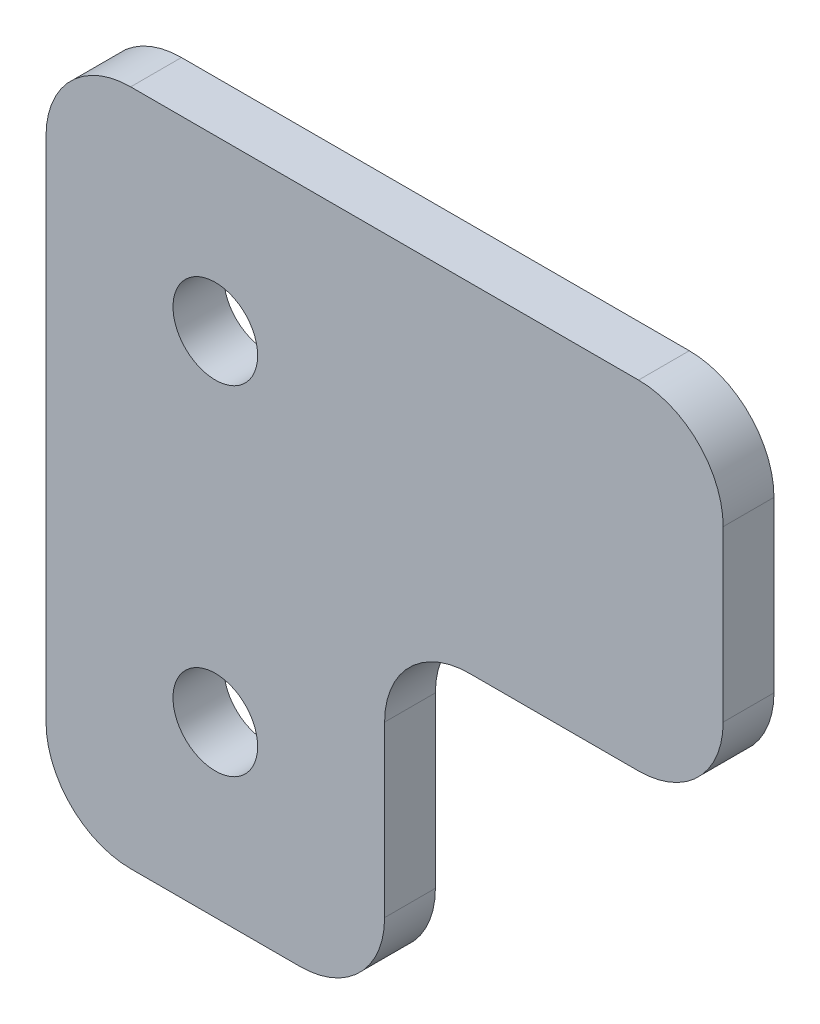
ISO-10303-21;
HEADER;
FILE_DESCRIPTION(('STEP AP214'),'2;1');
FILE_NAME('part.step','',(''),(''),'','','');
FILE_SCHEMA(('AUTOMOTIVE_DESIGN { 1 0 10303 214 1 1 1 1 }'));
ENDSEC;
DATA;
#1=APPLICATION_CONTEXT('core data for automotive mechanical design processes');
#2=APPLICATION_PROTOCOL_DEFINITION('international standard','automotive_design',2000,#1);
#3=PRODUCT_CONTEXT('',#1,'mechanical');
#4=PRODUCT('Part','Part','',(#3));
#5=PRODUCT_RELATED_PRODUCT_CATEGORY('part','',(#4));
#6=PRODUCT_DEFINITION_FORMATION('','',#4);
#7=PRODUCT_DEFINITION_CONTEXT('part definition',#1,'design');
#8=PRODUCT_DEFINITION('design','',#6,#7);
#9=PRODUCT_DEFINITION_SHAPE('','',#8);
#10=(LENGTH_UNIT() NAMED_UNIT(*) SI_UNIT(.MILLI.,.METRE.));
#11=(NAMED_UNIT(*) PLANE_ANGLE_UNIT() SI_UNIT($,.RADIAN.));
#12=(NAMED_UNIT(*) SI_UNIT($,.STERADIAN.) SOLID_ANGLE_UNIT());
#13=UNCERTAINTY_MEASURE_WITH_UNIT(LENGTH_MEASURE(1.E-05),#10,'distance_accuracy_value','');
#14=(GEOMETRIC_REPRESENTATION_CONTEXT(3) GLOBAL_UNCERTAINTY_ASSIGNED_CONTEXT((#13)) GLOBAL_UNIT_ASSIGNED_CONTEXT((#10,
#11,#12)) REPRESENTATION_CONTEXT('',''));
#15=CARTESIAN_POINT('',(0.,0.,0.));
#16=DIRECTION('',(0.,0.,1.));
#17=DIRECTION('',(1.,0.,0.));
#18=AXIS2_PLACEMENT_3D('',#15,#16,#17);
#19=CARTESIAN_POINT('',(0.,0.,3.));
#20=DIRECTION('',(0.,0.,-1.));
#21=DIRECTION('',(-1.,0.,0.));
#22=AXIS2_PLACEMENT_3D('',#19,#20,#21);
#23=PLANE('',#22);
#24=DIRECTION('',(0.,1.,0.));
#25=VECTOR('',#24,1.);
#26=CARTESIAN_POINT('',(30.,30.,3.));
#27=LINE('',#26,#25);
#28=CARTESIAN_POINT('',(30.,15.,3.));
#29=VERTEX_POINT('',#28);
#30=CARTESIAN_POINT('',(30.,25.,3.));
#31=VERTEX_POINT('',#30);
#32=EDGE_CURVE('E255',#29,#31,#27,.T.);
#33=ORIENTED_EDGE('',*,*,#32,.T.);
#34=CARTESIAN_POINT('',(25.,25.,3.));
#35=DIRECTION('',(0.,0.,-1.));
#36=DIRECTION('',(-1.,0.,0.));
#37=AXIS2_PLACEMENT_3D('',#34,#35,#36);
#38=CIRCLE('',#37,5.);
#39=CARTESIAN_POINT('',(25.,30.,3.));
#40=VERTEX_POINT('',#39);
#41=EDGE_CURVE('E206',#31,#40,#38,.F.);
#42=ORIENTED_EDGE('',*,*,#41,.T.);
#43=DIRECTION('',(-1.,0.,0.));
#44=VECTOR('',#43,1.);
#45=CARTESIAN_POINT('',(10.,30.,3.));
#46=LINE('',#45,#44);
#47=CARTESIAN_POINT('',(-5.,30.,3.));
#48=VERTEX_POINT('',#47);
#49=EDGE_CURVE('E156',#40,#48,#46,.T.);
#50=ORIENTED_EDGE('',*,*,#49,.T.);
#51=CARTESIAN_POINT('',(-5.,25.,3.));
#52=DIRECTION('',(0.,0.,-1.));
#53=DIRECTION('',(-1.,0.,0.));
#54=AXIS2_PLACEMENT_3D('',#51,#52,#53);
#55=CIRCLE('',#54,5.);
#56=CARTESIAN_POINT('',(-10.,25.,3.));
#57=VERTEX_POINT('',#56);
#58=EDGE_CURVE('E194',#48,#57,#55,.F.);
#59=ORIENTED_EDGE('',*,*,#58,.T.);
#60=DIRECTION('',(0.,-1.,0.));
#61=VECTOR('',#60,1.);
#62=CARTESIAN_POINT('',(-10.,30.,3.));
#63=LINE('',#62,#61);
#64=CARTESIAN_POINT('',(-9.99999999999999,-5.,3.));
#65=VERTEX_POINT('',#64);
#66=EDGE_CURVE('E165',#57,#65,#63,.T.);
#67=ORIENTED_EDGE('',*,*,#66,.T.);
#68=CARTESIAN_POINT('',(-5.,-5.,3.));
#69=DIRECTION('',(0.,0.,-1.));
#70=DIRECTION('',(-1.,0.,0.));
#71=AXIS2_PLACEMENT_3D('',#68,#69,#70);
#72=CIRCLE('',#71,5.);
#73=CARTESIAN_POINT('',(-5.,-10.,3.));
#74=VERTEX_POINT('',#73);
#75=EDGE_CURVE('E200',#65,#74,#72,.F.);
#76=ORIENTED_EDGE('',*,*,#75,.T.);
#77=DIRECTION('',(1.,0.,0.));
#78=VECTOR('',#77,1.);
#79=CARTESIAN_POINT('',(10.,-10.,3.));
#80=LINE('',#79,#78);
#81=CARTESIAN_POINT('',(5.00000000000001,-10.,3.));
#82=VERTEX_POINT('',#81);
#83=EDGE_CURVE('E171',#74,#82,#80,.T.);
#84=ORIENTED_EDGE('',*,*,#83,.T.);
#85=CARTESIAN_POINT('',(5.00000000000001,-5.,3.));
#86=DIRECTION('',(0.,0.,-1.));
#87=DIRECTION('',(-1.,0.,0.));
#88=AXIS2_PLACEMENT_3D('',#85,#86,#87);
#89=CIRCLE('',#88,5.);
#90=CARTESIAN_POINT('',(10.,-5.,3.));
#91=VERTEX_POINT('',#90);
#92=EDGE_CURVE('E197',#82,#91,#89,.F.);
#93=ORIENTED_EDGE('',*,*,#92,.T.);
#94=DIRECTION('',(0.,1.,0.));
#95=VECTOR('',#94,1.);
#96=CARTESIAN_POINT('',(10.,10.,3.));
#97=LINE('',#96,#95);
#98=CARTESIAN_POINT('',(10.,5.,3.));
#99=VERTEX_POINT('',#98);
#100=EDGE_CURVE('E256',#91,#99,#97,.T.);
#101=ORIENTED_EDGE('',*,*,#100,.T.);
#102=CARTESIAN_POINT('',(15.,5.,3.));
#103=DIRECTION('',(0.,0.,-1.));
#104=DIRECTION('',(-1.,0.,0.));
#105=AXIS2_PLACEMENT_3D('',#102,#103,#104);
#106=CIRCLE('',#105,5.);
#107=CARTESIAN_POINT('',(15.,10.,3.));
#108=VERTEX_POINT('',#107);
#109=EDGE_CURVE('E11',#99,#108,#106,.T.);
#110=ORIENTED_EDGE('',*,*,#109,.T.);
#111=DIRECTION('',(1.,0.,0.));
#112=VECTOR('',#111,1.);
#113=CARTESIAN_POINT('',(30.,10.,3.));
#114=LINE('',#113,#112);
#115=CARTESIAN_POINT('',(25.,10.,3.));
#116=VERTEX_POINT('',#115);
#117=EDGE_CURVE('E252',#108,#116,#114,.T.);
#118=ORIENTED_EDGE('',*,*,#117,.T.);
#119=CARTESIAN_POINT('',(25.,15.,3.));
#120=DIRECTION('',(0.,0.,-1.));
#121=DIRECTION('',(-1.,0.,0.));
#122=AXIS2_PLACEMENT_3D('',#119,#120,#121);
#123=CIRCLE('',#122,5.);
#124=EDGE_CURVE('E203',#116,#29,#123,.F.);
#125=ORIENTED_EDGE('',*,*,#124,.T.);
#126=EDGE_LOOP('',(#33,#42,#50,#59,#67,#76,#84,#93,#101,#110,#118,#125));
#127=FACE_BOUND('',#126,.T.);
#128=CARTESIAN_POINT('',(0.,0.,3.));
#129=DIRECTION('',(0.,0.,1.));
#130=DIRECTION('',(1.,0.,0.));
#131=AXIS2_PLACEMENT_3D('',#128,#129,#130);
#132=CIRCLE('',#131,2.5);
#133=CARTESIAN_POINT('',(2.5,0.,3.));
#134=VERTEX_POINT('',#133);
#135=EDGE_CURVE('E271',#134,#134,#132,.T.);
#136=ORIENTED_EDGE('',*,*,#135,.F.);
#137=EDGE_LOOP('',(#136));
#138=FACE_BOUND('',#137,.T.);
#139=CARTESIAN_POINT('',(0.,20.,3.));
#140=DIRECTION('',(0.,0.,1.));
#141=DIRECTION('',(1.,0.,0.));
#142=AXIS2_PLACEMENT_3D('',#139,#140,#141);
#143=CIRCLE('',#142,2.5);
#144=CARTESIAN_POINT('',(2.5,20.,3.));
#145=VERTEX_POINT('',#144);
#146=EDGE_CURVE('E282',#145,#145,#143,.T.);
#147=ORIENTED_EDGE('',*,*,#146,.F.);
#148=EDGE_LOOP('',(#147));
#149=FACE_BOUND('',#148,.T.);
#150=ADVANCED_FACE('F45',(#127,#138,#149),#23,.F.);
#151=CARTESIAN_POINT('',(0.,0.,0.));
#152=DIRECTION('',(0.,0.,-1.));
#153=DIRECTION('',(-1.,0.,0.));
#154=AXIS2_PLACEMENT_3D('',#151,#152,#153);
#155=PLANE('',#154);
#156=CARTESIAN_POINT('',(0.,0.,0.));
#157=DIRECTION('',(0.,0.,1.));
#158=DIRECTION('',(1.,0.,0.));
#159=AXIS2_PLACEMENT_3D('',#156,#157,#158);
#160=CIRCLE('',#159,2.5);
#161=CARTESIAN_POINT('',(2.5,0.,0.));
#162=VERTEX_POINT('',#161);
#163=EDGE_CURVE('E278',#162,#162,#160,.T.);
#164=ORIENTED_EDGE('',*,*,#163,.T.);
#165=EDGE_LOOP('',(#164));
#166=FACE_BOUND('',#165,.T.);
#167=DIRECTION('',(-1.,0.,0.));
#168=VECTOR('',#167,1.);
#169=CARTESIAN_POINT('',(10.,30.,0.));
#170=LINE('',#169,#168);
#171=CARTESIAN_POINT('',(25.,30.,0.));
#172=VERTEX_POINT('',#171);
#173=CARTESIAN_POINT('',(-5.,30.,0.));
#174=VERTEX_POINT('',#173);
#175=EDGE_CURVE('E153',#172,#174,#170,.T.);
#176=ORIENTED_EDGE('',*,*,#175,.F.);
#177=CARTESIAN_POINT('',(25.,25.,0.));
#178=DIRECTION('',(0.,0.,-1.));
#179=DIRECTION('',(-1.,0.,0.));
#180=AXIS2_PLACEMENT_3D('',#177,#178,#179);
#181=CIRCLE('',#180,5.);
#182=CARTESIAN_POINT('',(30.,25.,0.));
#183=VERTEX_POINT('',#182);
#184=EDGE_CURVE('E135',#172,#183,#181,.T.);
#185=ORIENTED_EDGE('',*,*,#184,.T.);
#186=DIRECTION('',(0.,1.,0.));
#187=VECTOR('',#186,1.);
#188=CARTESIAN_POINT('',(30.,30.,0.));
#189=LINE('',#188,#187);
#190=CARTESIAN_POINT('',(30.,15.,0.));
#191=VERTEX_POINT('',#190);
#192=EDGE_CURVE('E166',#191,#183,#189,.T.);
#193=ORIENTED_EDGE('',*,*,#192,.F.);
#194=CARTESIAN_POINT('',(25.,15.,0.));
#195=DIRECTION('',(0.,0.,-1.));
#196=DIRECTION('',(-1.,0.,0.));
#197=AXIS2_PLACEMENT_3D('',#194,#195,#196);
#198=CIRCLE('',#197,5.);
#199=CARTESIAN_POINT('',(25.,10.,0.));
#200=VERTEX_POINT('',#199);
#201=EDGE_CURVE('E147',#191,#200,#198,.T.);
#202=ORIENTED_EDGE('',*,*,#201,.T.);
#203=DIRECTION('',(1.,0.,0.));
#204=VECTOR('',#203,1.);
#205=CARTESIAN_POINT('',(30.,10.,0.));
#206=LINE('',#205,#204);
#207=CARTESIAN_POINT('',(15.,10.,0.));
#208=VERTEX_POINT('',#207);
#209=EDGE_CURVE('E173',#208,#200,#206,.T.);
#210=ORIENTED_EDGE('',*,*,#209,.F.);
#211=CARTESIAN_POINT('',(15.,5.,0.));
#212=DIRECTION('',(0.,0.,-1.));
#213=DIRECTION('',(-1.,0.,0.));
#214=AXIS2_PLACEMENT_3D('',#211,#212,#213);
#215=CIRCLE('',#214,5.);
#216=CARTESIAN_POINT('',(10.,5.,0.));
#217=VERTEX_POINT('',#216);
#218=EDGE_CURVE('E54',#208,#217,#215,.F.);
#219=ORIENTED_EDGE('',*,*,#218,.T.);
#220=DIRECTION('',(0.,1.,0.));
#221=VECTOR('',#220,1.);
#222=CARTESIAN_POINT('',(10.,10.,0.));
#223=LINE('',#222,#221);
#224=CARTESIAN_POINT('',(10.,-5.,0.));
#225=VERTEX_POINT('',#224);
#226=EDGE_CURVE('E239',#225,#217,#223,.T.);
#227=ORIENTED_EDGE('',*,*,#226,.F.);
#228=CARTESIAN_POINT('',(5.00000000000001,-5.,0.));
#229=DIRECTION('',(0.,0.,-1.));
#230=DIRECTION('',(-1.,0.,0.));
#231=AXIS2_PLACEMENT_3D('',#228,#229,#230);
#232=CIRCLE('',#231,5.);
#233=CARTESIAN_POINT('',(5.00000000000001,-10.,0.));
#234=VERTEX_POINT('',#233);
#235=EDGE_CURVE('E181',#225,#234,#232,.T.);
#236=ORIENTED_EDGE('',*,*,#235,.T.);
#237=DIRECTION('',(1.,0.,0.));
#238=VECTOR('',#237,1.);
#239=CARTESIAN_POINT('',(10.,-10.,0.));
#240=LINE('',#239,#238);
#241=CARTESIAN_POINT('',(-5.,-10.,0.));
#242=VERTEX_POINT('',#241);
#243=EDGE_CURVE('E248',#242,#234,#240,.T.);
#244=ORIENTED_EDGE('',*,*,#243,.F.);
#245=CARTESIAN_POINT('',(-5.,-5.,0.));
#246=DIRECTION('',(0.,0.,-1.));
#247=DIRECTION('',(-1.,0.,0.));
#248=AXIS2_PLACEMENT_3D('',#245,#246,#247);
#249=CIRCLE('',#248,5.);
#250=CARTESIAN_POINT('',(-9.99999999999999,-5.,0.));
#251=VERTEX_POINT('',#250);
#252=EDGE_CURVE('E184',#242,#251,#249,.T.);
#253=ORIENTED_EDGE('',*,*,#252,.T.);
#254=DIRECTION('',(0.,-1.,0.));
#255=VECTOR('',#254,1.);
#256=CARTESIAN_POINT('',(-10.,30.,0.));
#257=LINE('',#256,#255);
#258=CARTESIAN_POINT('',(-10.,25.,0.));
#259=VERTEX_POINT('',#258);
#260=EDGE_CURVE('E267',#259,#251,#257,.T.);
#261=ORIENTED_EDGE('',*,*,#260,.F.);
#262=CARTESIAN_POINT('',(-5.,25.,0.));
#263=DIRECTION('',(0.,0.,-1.));
#264=DIRECTION('',(-1.,0.,0.));
#265=AXIS2_PLACEMENT_3D('',#262,#263,#264);
#266=CIRCLE('',#265,5.);
#267=EDGE_CURVE('E158',#259,#174,#266,.T.);
#268=ORIENTED_EDGE('',*,*,#267,.T.);
#269=EDGE_LOOP('',(#176,#185,#193,#202,#210,#219,#227,#236,#244,#253,#261,#268));
#270=FACE_BOUND('',#269,.T.);
#271=CARTESIAN_POINT('',(0.,20.,0.));
#272=DIRECTION('',(0.,0.,1.));
#273=DIRECTION('',(1.,0.,0.));
#274=AXIS2_PLACEMENT_3D('',#271,#272,#273);
#275=CIRCLE('',#274,2.5);
#276=CARTESIAN_POINT('',(2.5,20.,0.));
#277=VERTEX_POINT('',#276);
#278=EDGE_CURVE('E286',#277,#277,#275,.T.);
#279=ORIENTED_EDGE('',*,*,#278,.T.);
#280=EDGE_LOOP('',(#279));
#281=FACE_BOUND('',#280,.T.);
#282=ADVANCED_FACE('F161',(#166,#270,#281),#155,.T.);
#283=CARTESIAN_POINT('',(-10.,30.,3.));
#284=DIRECTION('',(1.,0.,0.));
#285=DIRECTION('',(0.,1.,0.));
#286=AXIS2_PLACEMENT_3D('',#283,#284,#285);
#287=PLANE('',#286);
#288=ORIENTED_EDGE('',*,*,#260,.T.);
#289=DIRECTION('',(0.,0.,-1.));
#290=VECTOR('',#289,1.);
#291=CARTESIAN_POINT('',(-9.99999999999999,-5.,3.));
#292=LINE('',#291,#290);
#293=EDGE_CURVE('E226',#251,#65,#292,.F.);
#294=ORIENTED_EDGE('',*,*,#293,.T.);
#295=ORIENTED_EDGE('',*,*,#66,.F.);
#296=DIRECTION('',(0.,0.,-1.));
#297=VECTOR('',#296,1.);
#298=CARTESIAN_POINT('',(-10.,25.,3.));
#299=LINE('',#298,#297);
#300=EDGE_CURVE('E222',#57,#259,#299,.T.);
#301=ORIENTED_EDGE('',*,*,#300,.T.);
#302=EDGE_LOOP('',(#288,#294,#295,#301));
#303=FACE_BOUND('',#302,.T.);
#304=ADVANCED_FACE('F308',(#303),#287,.F.);
#305=CARTESIAN_POINT('',(10.,-10.,3.));
#306=DIRECTION('',(0.,1.,0.));
#307=DIRECTION('',(-1.,0.,0.));
#308=AXIS2_PLACEMENT_3D('',#305,#306,#307);
#309=PLANE('',#308);
#310=ORIENTED_EDGE('',*,*,#83,.F.);
#311=DIRECTION('',(0.,0.,-1.));
#312=VECTOR('',#311,1.);
#313=CARTESIAN_POINT('',(-5.,-10.,3.));
#314=LINE('',#313,#312);
#315=EDGE_CURVE('E218',#74,#242,#314,.T.);
#316=ORIENTED_EDGE('',*,*,#315,.T.);
#317=ORIENTED_EDGE('',*,*,#243,.T.);
#318=DIRECTION('',(0.,0.,-1.));
#319=VECTOR('',#318,1.);
#320=CARTESIAN_POINT('',(5.00000000000001,-10.,3.));
#321=LINE('',#320,#319);
#322=EDGE_CURVE('E215',#234,#82,#321,.F.);
#323=ORIENTED_EDGE('',*,*,#322,.T.);
#324=EDGE_LOOP('',(#310,#316,#317,#323));
#325=FACE_BOUND('',#324,.T.);
#326=ADVANCED_FACE('F303',(#325),#309,.F.);
#327=CARTESIAN_POINT('',(10.,10.,3.));
#328=DIRECTION('',(-1.,0.,0.));
#329=DIRECTION('',(0.,-1.,0.));
#330=AXIS2_PLACEMENT_3D('',#327,#328,#329);
#331=PLANE('',#330);
#332=ORIENTED_EDGE('',*,*,#100,.F.);
#333=DIRECTION('',(0.,0.,-1.));
#334=VECTOR('',#333,1.);
#335=CARTESIAN_POINT('',(10.,-5.,3.));
#336=LINE('',#335,#334);
#337=EDGE_CURVE('E232',#91,#225,#336,.T.);
#338=ORIENTED_EDGE('',*,*,#337,.T.);
#339=ORIENTED_EDGE('',*,*,#226,.T.);
#340=DIRECTION('',(0.,0.,-1.));
#341=VECTOR('',#340,1.);
#342=CARTESIAN_POINT('',(10.,5.,3.));
#343=LINE('',#342,#341);
#344=EDGE_CURVE('E229',#217,#99,#343,.F.);
#345=ORIENTED_EDGE('',*,*,#344,.T.);
#346=EDGE_LOOP('',(#332,#338,#339,#345));
#347=FACE_BOUND('',#346,.T.);
#348=ADVANCED_FACE('F245',(#347),#331,.F.);
#349=CARTESIAN_POINT('',(30.,10.,3.));
#350=DIRECTION('',(0.,1.,0.));
#351=DIRECTION('',(-1.,0.,0.));
#352=AXIS2_PLACEMENT_3D('',#349,#350,#351);
#353=PLANE('',#352);
#354=ORIENTED_EDGE('',*,*,#209,.T.);
#355=DIRECTION('',(0.,0.,-1.));
#356=VECTOR('',#355,1.);
#357=CARTESIAN_POINT('',(25.,10.,3.));
#358=LINE('',#357,#356);
#359=EDGE_CURVE('E61',#200,#116,#358,.F.);
#360=ORIENTED_EDGE('',*,*,#359,.T.);
#361=ORIENTED_EDGE('',*,*,#117,.F.);
#362=DIRECTION('',(0.,0.,-1.));
#363=VECTOR('',#362,1.);
#364=CARTESIAN_POINT('',(15.,10.,0.));
#365=LINE('',#364,#363);
#366=EDGE_CURVE('E209',#108,#208,#365,.T.);
#367=ORIENTED_EDGE('',*,*,#366,.T.);
#368=EDGE_LOOP('',(#354,#360,#361,#367));
#369=FACE_BOUND('',#368,.T.);
#370=ADVANCED_FACE('F251',(#369),#353,.F.);
#371=CARTESIAN_POINT('',(30.,30.,3.));
#372=DIRECTION('',(-1.,0.,0.));
#373=DIRECTION('',(0.,-1.,0.));
#374=AXIS2_PLACEMENT_3D('',#371,#372,#373);
#375=PLANE('',#374);
#376=ORIENTED_EDGE('',*,*,#192,.T.);
#377=DIRECTION('',(0.,0.,-1.));
#378=VECTOR('',#377,1.);
#379=CARTESIAN_POINT('',(30.,25.,3.));
#380=LINE('',#379,#378);
#381=EDGE_CURVE('E140',#183,#31,#380,.F.);
#382=ORIENTED_EDGE('',*,*,#381,.T.);
#383=ORIENTED_EDGE('',*,*,#32,.F.);
#384=DIRECTION('',(0.,0.,-1.));
#385=VECTOR('',#384,1.);
#386=CARTESIAN_POINT('',(30.,15.,3.));
#387=LINE('',#386,#385);
#388=EDGE_CURVE('E146',#29,#191,#387,.T.);
#389=ORIENTED_EDGE('',*,*,#388,.T.);
#390=EDGE_LOOP('',(#376,#382,#383,#389));
#391=FACE_BOUND('',#390,.T.);
#392=ADVANCED_FACE('F316',(#391),#375,.F.);
#393=CARTESIAN_POINT('',(10.,30.,3.));
#394=DIRECTION('',(0.,-1.,0.));
#395=DIRECTION('',(1.,0.,0.));
#396=AXIS2_PLACEMENT_3D('',#393,#394,#395);
#397=PLANE('',#396);
#398=ORIENTED_EDGE('',*,*,#49,.F.);
#399=DIRECTION('',(0.,0.,-1.));
#400=VECTOR('',#399,1.);
#401=CARTESIAN_POINT('',(25.,30.,3.));
#402=LINE('',#401,#400);
#403=EDGE_CURVE('E139',#40,#172,#402,.T.);
#404=ORIENTED_EDGE('',*,*,#403,.T.);
#405=ORIENTED_EDGE('',*,*,#175,.T.);
#406=DIRECTION('',(0.,0.,-1.));
#407=VECTOR('',#406,1.);
#408=CARTESIAN_POINT('',(-5.,30.,3.));
#409=LINE('',#408,#407);
#410=EDGE_CURVE('E159',#174,#48,#409,.F.);
#411=ORIENTED_EDGE('',*,*,#410,.T.);
#412=EDGE_LOOP('',(#398,#404,#405,#411));
#413=FACE_BOUND('',#412,.T.);
#414=ADVANCED_FACE('F152',(#413),#397,.F.);
#415=CARTESIAN_POINT('',(0.,0.,3.));
#416=DIRECTION('',(0.,0.,-1.));
#417=DIRECTION('',(-1.,0.,0.));
#418=AXIS2_PLACEMENT_3D('',#415,#416,#417);
#419=CYLINDRICAL_SURFACE('',#418,2.5);
#420=ORIENTED_EDGE('',*,*,#135,.T.);
#421=EDGE_LOOP('',(#420));
#422=FACE_BOUND('',#421,.T.);
#423=ORIENTED_EDGE('',*,*,#163,.F.);
#424=EDGE_LOOP('',(#423));
#425=FACE_BOUND('',#424,.T.);
#426=ADVANCED_FACE('F337',(#422,#425),#419,.F.);
#427=CARTESIAN_POINT('',(0.,20.,3.));
#428=DIRECTION('',(0.,0.,-1.));
#429=DIRECTION('',(-1.,0.,0.));
#430=AXIS2_PLACEMENT_3D('',#427,#428,#429);
#431=CYLINDRICAL_SURFACE('',#430,2.5);
#432=ORIENTED_EDGE('',*,*,#146,.T.);
#433=EDGE_LOOP('',(#432));
#434=FACE_BOUND('',#433,.T.);
#435=ORIENTED_EDGE('',*,*,#278,.F.);
#436=EDGE_LOOP('',(#435));
#437=FACE_BOUND('',#436,.T.);
#438=ADVANCED_FACE('F326',(#434,#437),#431,.F.);
#439=CARTESIAN_POINT('',(25.,25.,3.));
#440=DIRECTION('',(0.,0.,-1.));
#441=DIRECTION('',(-1.,0.,0.));
#442=AXIS2_PLACEMENT_3D('',#439,#440,#441);
#443=CYLINDRICAL_SURFACE('',#442,5.);
#444=ORIENTED_EDGE('',*,*,#41,.F.);
#445=ORIENTED_EDGE('',*,*,#381,.F.);
#446=ORIENTED_EDGE('',*,*,#184,.F.);
#447=ORIENTED_EDGE('',*,*,#403,.F.);
#448=EDGE_LOOP('',(#444,#445,#446,#447));
#449=FACE_BOUND('',#448,.T.);
#450=ADVANCED_FACE('F138',(#449),#443,.T.);
#451=CARTESIAN_POINT('',(25.,15.,3.));
#452=DIRECTION('',(0.,0.,-1.));
#453=DIRECTION('',(-1.,0.,0.));
#454=AXIS2_PLACEMENT_3D('',#451,#452,#453);
#455=CYLINDRICAL_SURFACE('',#454,5.);
#456=ORIENTED_EDGE('',*,*,#124,.F.);
#457=ORIENTED_EDGE('',*,*,#359,.F.);
#458=ORIENTED_EDGE('',*,*,#201,.F.);
#459=ORIENTED_EDGE('',*,*,#388,.F.);
#460=EDGE_LOOP('',(#456,#457,#458,#459));
#461=FACE_BOUND('',#460,.T.);
#462=ADVANCED_FACE('F318',(#461),#455,.T.);
#463=CARTESIAN_POINT('',(-5.,-5.,3.));
#464=DIRECTION('',(0.,0.,-1.));
#465=DIRECTION('',(-1.,0.,0.));
#466=AXIS2_PLACEMENT_3D('',#463,#464,#465);
#467=CYLINDRICAL_SURFACE('',#466,5.);
#468=ORIENTED_EDGE('',*,*,#75,.F.);
#469=ORIENTED_EDGE('',*,*,#293,.F.);
#470=ORIENTED_EDGE('',*,*,#252,.F.);
#471=ORIENTED_EDGE('',*,*,#315,.F.);
#472=EDGE_LOOP('',(#468,#469,#470,#471));
#473=FACE_BOUND('',#472,.T.);
#474=ADVANCED_FACE('F305',(#473),#467,.T.);
#475=CARTESIAN_POINT('',(5.00000000000001,-5.,3.));
#476=DIRECTION('',(0.,0.,-1.));
#477=DIRECTION('',(-1.,0.,0.));
#478=AXIS2_PLACEMENT_3D('',#475,#476,#477);
#479=CYLINDRICAL_SURFACE('',#478,5.);
#480=ORIENTED_EDGE('',*,*,#92,.F.);
#481=ORIENTED_EDGE('',*,*,#322,.F.);
#482=ORIENTED_EDGE('',*,*,#235,.F.);
#483=ORIENTED_EDGE('',*,*,#337,.F.);
#484=EDGE_LOOP('',(#480,#481,#482,#483));
#485=FACE_BOUND('',#484,.T.);
#486=ADVANCED_FACE('F301',(#485),#479,.T.);
#487=CARTESIAN_POINT('',(15.,5.,3.));
#488=DIRECTION('',(0.,0.,1.));
#489=DIRECTION('',(1.,0.,0.));
#490=AXIS2_PLACEMENT_3D('',#487,#488,#489);
#491=CYLINDRICAL_SURFACE('',#490,5.);
#492=ORIENTED_EDGE('',*,*,#109,.F.);
#493=ORIENTED_EDGE('',*,*,#344,.F.);
#494=ORIENTED_EDGE('',*,*,#218,.F.);
#495=ORIENTED_EDGE('',*,*,#366,.F.);
#496=EDGE_LOOP('',(#492,#493,#494,#495));
#497=FACE_BOUND('',#496,.T.);
#498=ADVANCED_FACE('F250',(#497),#491,.F.);
#499=CARTESIAN_POINT('',(-5.,25.,3.));
#500=DIRECTION('',(0.,0.,-1.));
#501=DIRECTION('',(-1.,0.,0.));
#502=AXIS2_PLACEMENT_3D('',#499,#500,#501);
#503=CYLINDRICAL_SURFACE('',#502,5.);
#504=ORIENTED_EDGE('',*,*,#58,.F.);
#505=ORIENTED_EDGE('',*,*,#410,.F.);
#506=ORIENTED_EDGE('',*,*,#267,.F.);
#507=ORIENTED_EDGE('',*,*,#300,.F.);
#508=EDGE_LOOP('',(#504,#505,#506,#507));
#509=FACE_BOUND('',#508,.T.);
#510=ADVANCED_FACE('F47',(#509),#503,.T.);
#511=CLOSED_SHELL('',(#150,#282,#304,#326,#348,#370,#392,#414,#426,#438,#450,#462,#474,#486,
#498,#510));
#512=MANIFOLD_SOLID_BREP('B2',#511);
#513=ADVANCED_BREP_SHAPE_REPRESENTATION('',(#18,#512),#14);
#514=SHAPE_DEFINITION_REPRESENTATION(#9,#513);
ENDSEC;
END-ISO-10303-21;
